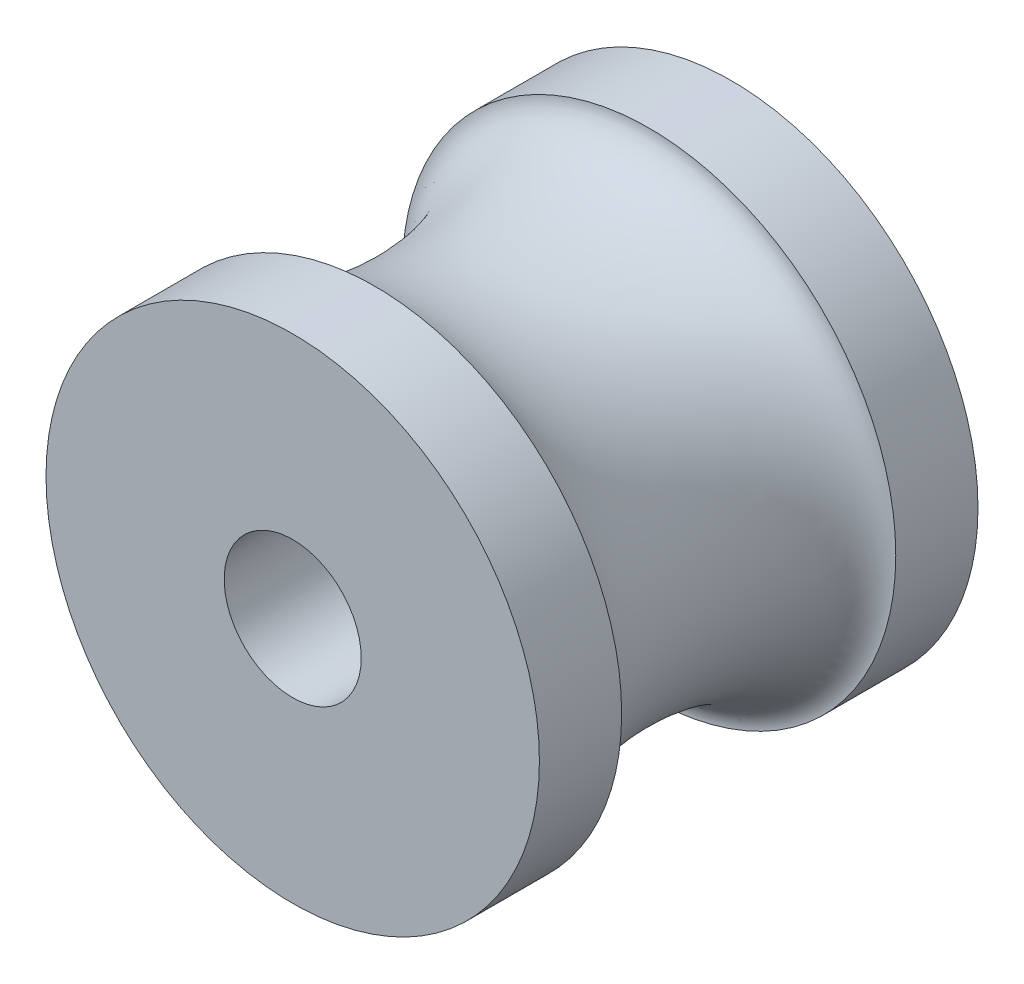
ISO-10303-21;
HEADER;
FILE_DESCRIPTION(('STEP AP214'),'2;1');
FILE_NAME('part.step','',(''),(''),'','','');
FILE_SCHEMA(('AUTOMOTIVE_DESIGN { 1 0 10303 214 1 1 1 1 }'));
ENDSEC;
DATA;
#1=APPLICATION_CONTEXT('core data for automotive mechanical design processes');
#2=APPLICATION_PROTOCOL_DEFINITION('international standard','automotive_design',2000,#1);
#3=PRODUCT_CONTEXT('',#1,'mechanical');
#4=PRODUCT('Part','Part','',(#3));
#5=PRODUCT_RELATED_PRODUCT_CATEGORY('part','',(#4));
#6=PRODUCT_DEFINITION_FORMATION('','',#4);
#7=PRODUCT_DEFINITION_CONTEXT('part definition',#1,'design');
#8=PRODUCT_DEFINITION('design','',#6,#7);
#9=PRODUCT_DEFINITION_SHAPE('','',#8);
#10=(LENGTH_UNIT() NAMED_UNIT(*) SI_UNIT(.MILLI.,.METRE.));
#11=(NAMED_UNIT(*) PLANE_ANGLE_UNIT() SI_UNIT($,.RADIAN.));
#12=(NAMED_UNIT(*) SI_UNIT($,.STERADIAN.) SOLID_ANGLE_UNIT());
#13=UNCERTAINTY_MEASURE_WITH_UNIT(LENGTH_MEASURE(1.E-05),#10,'distance_accuracy_value','');
#14=(GEOMETRIC_REPRESENTATION_CONTEXT(3) GLOBAL_UNCERTAINTY_ASSIGNED_CONTEXT((#13)) GLOBAL_UNIT_ASSIGNED_CONTEXT((#10,
#11,#12)) REPRESENTATION_CONTEXT('',''));
#15=CARTESIAN_POINT('',(0.,0.,0.));
#16=DIRECTION('',(0.,0.,1.));
#17=DIRECTION('',(1.,0.,0.));
#18=AXIS2_PLACEMENT_3D('',#15,#16,#17);
#19=CARTESIAN_POINT('',(0.,0.,16.));
#20=DIRECTION('',(0.,0.,-1.));
#21=DIRECTION('',(-1.,0.,0.));
#22=AXIS2_PLACEMENT_3D('',#19,#20,#21);
#23=CYLINDRICAL_SURFACE('',#22,9.);
#24=CARTESIAN_POINT('',(0.,0.,3.));
#25=DIRECTION('',(0.,0.,-1.));
#26=DIRECTION('',(-1.,0.,0.));
#27=AXIS2_PLACEMENT_3D('',#24,#25,#26);
#28=CIRCLE('',#27,9.);
#29=CARTESIAN_POINT('',(-9.,0.,3.));
#30=VERTEX_POINT('',#29);
#31=EDGE_CURVE('E35',#30,#30,#28,.T.);
#32=ORIENTED_EDGE('',*,*,#31,.T.);
#33=EDGE_LOOP('',(#32));
#34=FACE_BOUND('',#33,.T.);
#35=CARTESIAN_POINT('',(0.,0.,0.));
#36=DIRECTION('',(0.,0.,1.));
#37=DIRECTION('',(1.,0.,0.));
#38=AXIS2_PLACEMENT_3D('',#35,#36,#37);
#39=CIRCLE('',#38,9.);
#40=CARTESIAN_POINT('',(9.,0.,0.));
#41=VERTEX_POINT('',#40);
#42=EDGE_CURVE('E39',#41,#41,#39,.T.);
#43=ORIENTED_EDGE('',*,*,#42,.T.);
#44=EDGE_LOOP('',(#43));
#45=FACE_BOUND('',#44,.T.);
#46=ADVANCED_FACE('F31',(#34,#45),#23,.T.);
#47=CARTESIAN_POINT('',(0.,0.,16.));
#48=DIRECTION('',(0.,0.,1.));
#49=DIRECTION('',(1.,0.,0.));
#50=AXIS2_PLACEMENT_3D('',#47,#48,#49);
#51=PLANE('',#50);
#52=CARTESIAN_POINT('',(0.,0.,16.));
#53=DIRECTION('',(0.,0.,1.));
#54=DIRECTION('',(1.,0.,0.));
#55=AXIS2_PLACEMENT_3D('',#52,#53,#54);
#56=CIRCLE('',#55,9.);
#57=CARTESIAN_POINT('',(9.,0.,16.));
#58=VERTEX_POINT('',#57);
#59=EDGE_CURVE('E10',#58,#58,#56,.T.);
#60=ORIENTED_EDGE('',*,*,#59,.T.);
#61=EDGE_LOOP('',(#60));
#62=FACE_BOUND('',#61,.T.);
#63=CARTESIAN_POINT('',(0.,0.,16.));
#64=DIRECTION('',(0.,0.,1.));
#65=DIRECTION('',(1.,0.,0.));
#66=AXIS2_PLACEMENT_3D('',#63,#64,#65);
#67=CIRCLE('',#66,2.5);
#68=CARTESIAN_POINT('',(2.5,0.,16.));
#69=VERTEX_POINT('',#68);
#70=EDGE_CURVE('E44',#69,#69,#67,.T.);
#71=ORIENTED_EDGE('',*,*,#70,.F.);
#72=EDGE_LOOP('',(#71));
#73=FACE_BOUND('',#72,.T.);
#74=ADVANCED_FACE('F72',(#62,#73),#51,.T.);
#75=CARTESIAN_POINT('',(0.,0.,0.));
#76=DIRECTION('',(0.,0.,1.));
#77=DIRECTION('',(1.,0.,0.));
#78=AXIS2_PLACEMENT_3D('',#75,#76,#77);
#79=PLANE('',#78);
#80=ORIENTED_EDGE('',*,*,#42,.F.);
#81=EDGE_LOOP('',(#80));
#82=FACE_BOUND('',#81,.T.);
#83=CARTESIAN_POINT('',(0.,0.,0.));
#84=DIRECTION('',(0.,0.,1.));
#85=DIRECTION('',(1.,0.,0.));
#86=AXIS2_PLACEMENT_3D('',#83,#84,#85);
#87=CIRCLE('',#86,2.5);
#88=CARTESIAN_POINT('',(2.5,0.,0.));
#89=VERTEX_POINT('',#88);
#90=EDGE_CURVE('E47',#89,#89,#87,.T.);
#91=ORIENTED_EDGE('',*,*,#90,.T.);
#92=EDGE_LOOP('',(#91));
#93=FACE_BOUND('',#92,.T.);
#94=ADVANCED_FACE('F74',(#82,#93),#79,.F.);
#95=CARTESIAN_POINT('',(0.,0.,13.));
#96=DIRECTION('',(0.,0.,-1.));
#97=DIRECTION('',(-1.,0.,0.));
#98=AXIS2_PLACEMENT_3D('',#95,#96,#97);
#99=CIRCLE('',#98,9.);
#100=CARTESIAN_POINT('',(-9.,0.,13.));
#101=VERTEX_POINT('',#100);
#102=EDGE_CURVE('E49',#101,#101,#99,.F.);
#103=ORIENTED_EDGE('',*,*,#102,.T.);
#104=EDGE_LOOP('',(#103));
#105=FACE_BOUND('',#104,.T.);
#106=ORIENTED_EDGE('',*,*,#59,.F.);
#107=EDGE_LOOP('',(#106));
#108=FACE_BOUND('',#107,.T.);
#109=ADVANCED_FACE('F33',(#105,#108),#23,.T.);
#110=CARTESIAN_POINT('',(0.,0.,16.));
#111=DIRECTION('',(0.,0.,-1.));
#112=DIRECTION('',(-1.,0.,0.));
#113=AXIS2_PLACEMENT_3D('',#110,#111,#112);
#114=CYLINDRICAL_SURFACE('',#113,2.5);
#115=ORIENTED_EDGE('',*,*,#70,.T.);
#116=EDGE_LOOP('',(#115));
#117=FACE_BOUND('',#116,.T.);
#118=ORIENTED_EDGE('',*,*,#90,.F.);
#119=EDGE_LOOP('',(#118));
#120=FACE_BOUND('',#119,.T.);
#121=ADVANCED_FACE('F68',(#117,#120),#114,.F.);
#122=CARTESIAN_POINT('',(0.,9.,8.));
#123=DIRECTION('',(1.,0.,0.));
#124=DIRECTION('',(0.,0.,-1.));
#125=AXIS2_PLACEMENT_3D('',#122,#123,#124);
#126=ELLIPSE('',#125,5.,2.);
#127=CARTESIAN_POINT('',(0.,0.,0.));
#128=DIRECTION('',(0.,0.,-1.));
#129=AXIS1_PLACEMENT('',#127,#128);
#130=SURFACE_OF_REVOLUTION('',#126,#129);
#131=ORIENTED_EDGE('',*,*,#102,.F.);
#132=EDGE_LOOP('',(#131));
#133=FACE_BOUND('',#132,.T.);
#134=ORIENTED_EDGE('',*,*,#31,.F.);
#135=EDGE_LOOP('',(#134));
#136=FACE_BOUND('',#135,.T.);
#137=ADVANCED_FACE('F65',(#133,#136),#130,.T.);
#138=CLOSED_SHELL('',(#46,#74,#94,#109,#121,#137));
#139=MANIFOLD_SOLID_BREP('B2',#138);
#140=ADVANCED_BREP_SHAPE_REPRESENTATION('',(#18,#139),#14);
#141=SHAPE_DEFINITION_REPRESENTATION(#9,#140);
ENDSEC;
END-ISO-10303-21;
